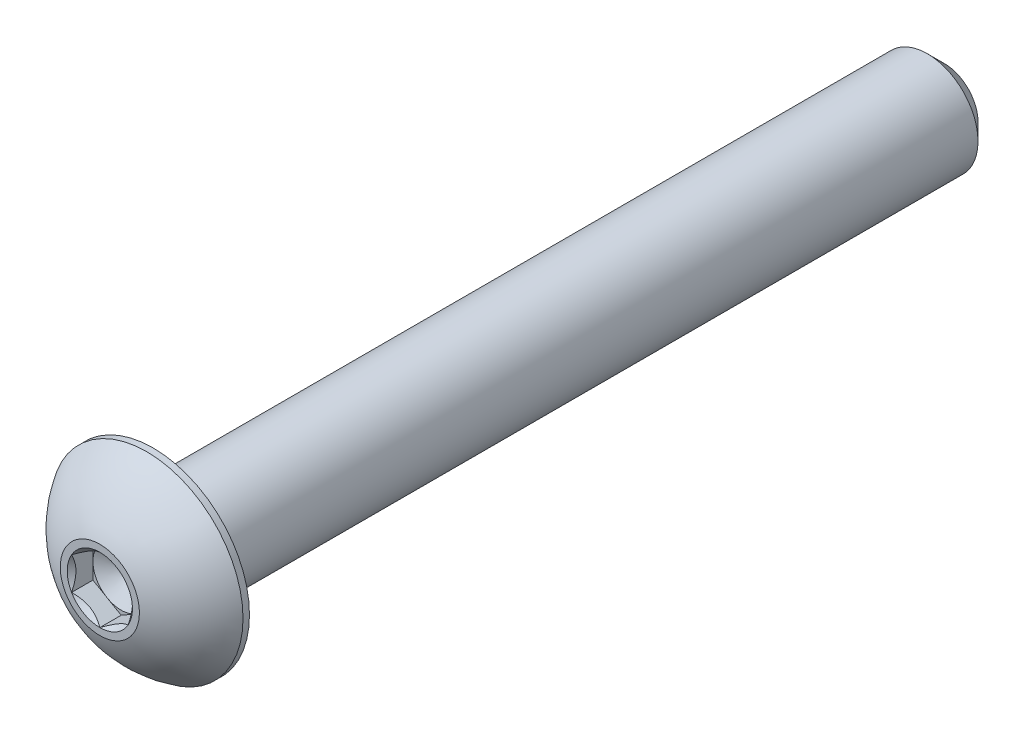
ISO-10303-21;
HEADER;
FILE_DESCRIPTION(('STEP AP214'),'2;1');
FILE_NAME('part.step','',(''),(''),'','','');
FILE_SCHEMA(('AUTOMOTIVE_DESIGN { 1 0 10303 214 1 1 1 1 }'));
ENDSEC;
DATA;
#1=APPLICATION_CONTEXT('core data for automotive mechanical design processes');
#2=APPLICATION_PROTOCOL_DEFINITION('international standard','automotive_design',2000,#1);
#3=PRODUCT_CONTEXT('',#1,'mechanical');
#4=PRODUCT('Part','Part','',(#3));
#5=PRODUCT_RELATED_PRODUCT_CATEGORY('part','',(#4));
#6=PRODUCT_DEFINITION_FORMATION('','',#4);
#7=PRODUCT_DEFINITION_CONTEXT('part definition',#1,'design');
#8=PRODUCT_DEFINITION('design','',#6,#7);
#9=PRODUCT_DEFINITION_SHAPE('','',#8);
#10=(LENGTH_UNIT() NAMED_UNIT(*) SI_UNIT(.MILLI.,.METRE.));
#11=(NAMED_UNIT(*) PLANE_ANGLE_UNIT() SI_UNIT($,.RADIAN.));
#12=(NAMED_UNIT(*) SI_UNIT($,.STERADIAN.) SOLID_ANGLE_UNIT());
#13=UNCERTAINTY_MEASURE_WITH_UNIT(LENGTH_MEASURE(1.E-05),#10,'distance_accuracy_value','');
#14=(GEOMETRIC_REPRESENTATION_CONTEXT(3) GLOBAL_UNCERTAINTY_ASSIGNED_CONTEXT((#13)) GLOBAL_UNIT_ASSIGNED_CONTEXT((#10,
#11,#12)) REPRESENTATION_CONTEXT('',''));
#15=CARTESIAN_POINT('',(0.,0.,0.));
#16=DIRECTION('',(0.,0.,1.));
#17=DIRECTION('',(1.,0.,0.));
#18=AXIS2_PLACEMENT_3D('',#15,#16,#17);
#19=CARTESIAN_POINT('',(0.,0.79375,11.8618));
#20=DIRECTION('',(0.,0.,-1.));
#21=DIRECTION('',(-1.,0.,0.));
#22=AXIS2_PLACEMENT_3D('',#19,#20,#21);
#23=PLANE('',#22);
#24=CARTESIAN_POINT('',(0.,0.,11.8618));
#25=DIRECTION('',(0.,0.,1.));
#26=DIRECTION('',(1.,0.,0.));
#27=AXIS2_PLACEMENT_3D('',#24,#25,#26);
#28=CIRCLE('',#27,1.11125);
#29=CARTESIAN_POINT('',(0.,1.11125,11.8618));
#30=VERTEX_POINT('',#29);
#31=EDGE_CURVE('E167',#30,#30,#28,.T.);
#32=ORIENTED_EDGE('',*,*,#31,.T.);
#33=EDGE_LOOP('',(#32));
#34=FACE_BOUND('',#33,.T.);
#35=CARTESIAN_POINT('',(0.,0.,11.8618));
#36=DIRECTION('',(0.,0.,1.));
#37=DIRECTION('',(1.,0.,0.));
#38=AXIS2_PLACEMENT_3D('',#35,#36,#37);
#39=CIRCLE('',#38,0.916543552338531);
#40=CARTESIAN_POINT('',(0.,0.916543552338531,11.8618));
#41=VERTEX_POINT('',#40);
#42=CARTESIAN_POINT('',(-0.79375,0.458271776169265,11.8618));
#43=VERTEX_POINT('',#42);
#44=EDGE_CURVE('E121',#41,#43,#39,.T.);
#45=ORIENTED_EDGE('',*,*,#44,.F.);
#46=CARTESIAN_POINT('',(0.,0.,11.8618));
#47=DIRECTION('',(0.,0.,1.));
#48=DIRECTION('',(1.,0.,0.));
#49=AXIS2_PLACEMENT_3D('',#46,#47,#48);
#50=CIRCLE('',#49,0.916543552338531);
#51=CARTESIAN_POINT('',(0.79375,0.458271776169266,11.8618));
#52=VERTEX_POINT('',#51);
#53=EDGE_CURVE('E106',#52,#41,#50,.T.);
#54=ORIENTED_EDGE('',*,*,#53,.F.);
#55=CARTESIAN_POINT('',(0.,0.,11.8618));
#56=DIRECTION('',(0.,0.,1.));
#57=DIRECTION('',(1.,0.,0.));
#58=AXIS2_PLACEMENT_3D('',#55,#56,#57);
#59=CIRCLE('',#58,0.916543552338531);
#60=CARTESIAN_POINT('',(0.79375,-0.458271776169265,11.8618));
#61=VERTEX_POINT('',#60);
#62=EDGE_CURVE('E117',#61,#52,#59,.T.);
#63=ORIENTED_EDGE('',*,*,#62,.F.);
#64=CARTESIAN_POINT('',(0.,0.,11.8618));
#65=DIRECTION('',(0.,0.,1.));
#66=DIRECTION('',(1.,0.,0.));
#67=AXIS2_PLACEMENT_3D('',#64,#65,#66);
#68=CIRCLE('',#67,0.916543552338531);
#69=CARTESIAN_POINT('',(0.,-0.916543552338531,11.8618));
#70=VERTEX_POINT('',#69);
#71=EDGE_CURVE('E138',#70,#61,#68,.T.);
#72=ORIENTED_EDGE('',*,*,#71,.F.);
#73=CARTESIAN_POINT('',(0.,0.,11.8618));
#74=DIRECTION('',(0.,0.,1.));
#75=DIRECTION('',(1.,0.,0.));
#76=AXIS2_PLACEMENT_3D('',#73,#74,#75);
#77=CIRCLE('',#76,0.916543552338531);
#78=CARTESIAN_POINT('',(-0.79375,-0.458271776169266,11.8618));
#79=VERTEX_POINT('',#78);
#80=EDGE_CURVE('E438',#79,#70,#77,.T.);
#81=ORIENTED_EDGE('',*,*,#80,.F.);
#82=CARTESIAN_POINT('',(0.,0.,11.8618));
#83=DIRECTION('',(0.,0.,1.));
#84=DIRECTION('',(1.,0.,0.));
#85=AXIS2_PLACEMENT_3D('',#82,#83,#84);
#86=CIRCLE('',#85,0.916543552338531);
#87=EDGE_CURVE('E447',#43,#79,#86,.T.);
#88=ORIENTED_EDGE('',*,*,#87,.F.);
#89=EDGE_LOOP('',(#45,#54,#63,#72,#81,#88));
#90=FACE_BOUND('',#89,.T.);
#91=ADVANCED_FACE('F33',(#34,#90),#23,.F.);
#92=CARTESIAN_POINT('',(0.,0.,-11.8618));
#93=DIRECTION('',(0.,0.,1.));
#94=DIRECTION('',(1.,0.,0.));
#95=AXIS2_PLACEMENT_3D('',#92,#93,#94);
#96=CONICAL_SURFACE('',#95,0.946150000000005,0.785398163397447);
#97=CARTESIAN_POINT('',(0.,0.,-11.38555));
#98=DIRECTION('',(0.,0.,1.));
#99=DIRECTION('',(1.,0.,0.));
#100=AXIS2_PLACEMENT_3D('',#97,#98,#99);
#101=CIRCLE('',#100,1.4224);
#102=CARTESIAN_POINT('',(1.4224,0.,-11.38555));
#103=VERTEX_POINT('',#102);
#104=EDGE_CURVE('E11',#103,#103,#101,.T.);
#105=ORIENTED_EDGE('',*,*,#104,.F.);
#106=EDGE_LOOP('',(#105));
#107=FACE_BOUND('',#106,.T.);
#108=CARTESIAN_POINT('',(0.,0.,-11.8618));
#109=DIRECTION('',(0.,0.,1.));
#110=DIRECTION('',(1.,0.,0.));
#111=AXIS2_PLACEMENT_3D('',#108,#109,#110);
#112=CIRCLE('',#111,0.946150000000005);
#113=CARTESIAN_POINT('',(0.946150000000005,0.,-11.8618));
#114=VERTEX_POINT('',#113);
#115=EDGE_CURVE('E160',#114,#114,#112,.T.);
#116=ORIENTED_EDGE('',*,*,#115,.T.);
#117=EDGE_LOOP('',(#116));
#118=FACE_BOUND('',#117,.T.);
#119=ADVANCED_FACE('F35',(#107,#118),#96,.T.);
#120=CARTESIAN_POINT('',(0.,0.,11.8618));
#121=DIRECTION('',(0.,0.,1.));
#122=DIRECTION('',(1.,0.,0.));
#123=AXIS2_PLACEMENT_3D('',#120,#121,#122);
#124=CYLINDRICAL_SURFACE('',#123,1.4224);
#125=CARTESIAN_POINT('',(0.,0.,10.3632));
#126=DIRECTION('',(0.,0.,1.));
#127=DIRECTION('',(1.,0.,0.));
#128=AXIS2_PLACEMENT_3D('',#125,#126,#127);
#129=CIRCLE('',#128,1.4224);
#130=CARTESIAN_POINT('',(1.4224,0.,10.3632));
#131=VERTEX_POINT('',#130);
#132=EDGE_CURVE('E41',#131,#131,#129,.T.);
#133=ORIENTED_EDGE('',*,*,#132,.F.);
#134=EDGE_LOOP('',(#133));
#135=FACE_BOUND('',#134,.T.);
#136=ORIENTED_EDGE('',*,*,#104,.T.);
#137=EDGE_LOOP('',(#136));
#138=FACE_BOUND('',#137,.T.);
#139=ADVANCED_FACE('F181',(#135,#138),#124,.T.);
#140=CARTESIAN_POINT('',(0.,2.7051,10.3632));
#141=DIRECTION('',(0.,0.,1.));
#142=DIRECTION('',(1.,0.,0.));
#143=AXIS2_PLACEMENT_3D('',#140,#141,#142);
#144=PLANE('',#143);
#145=CARTESIAN_POINT('',(0.,0.,10.3632));
#146=DIRECTION('',(0.,0.,1.));
#147=DIRECTION('',(1.,0.,0.));
#148=AXIS2_PLACEMENT_3D('',#145,#146,#147);
#149=CIRCLE('',#148,2.7051);
#150=CARTESIAN_POINT('',(2.7051,0.,10.3632));
#151=VERTEX_POINT('',#150);
#152=EDGE_CURVE('E174',#151,#151,#149,.T.);
#153=ORIENTED_EDGE('',*,*,#152,.F.);
#154=EDGE_LOOP('',(#153));
#155=FACE_BOUND('',#154,.T.);
#156=ORIENTED_EDGE('',*,*,#132,.T.);
#157=EDGE_LOOP('',(#156));
#158=FACE_BOUND('',#157,.T.);
#159=ADVANCED_FACE('F179',(#155,#158),#144,.F.);
#160=CARTESIAN_POINT('',(0.,0.,11.8618));
#161=DIRECTION('',(0.,0.,1.));
#162=DIRECTION('',(1.,0.,0.));
#163=AXIS2_PLACEMENT_3D('',#160,#161,#162);
#164=CYLINDRICAL_SURFACE('',#163,2.7051);
#165=CARTESIAN_POINT('',(0.,0.,10.5446285714286));
#166=DIRECTION('',(0.,0.,1.));
#167=DIRECTION('',(1.,0.,0.));
#168=AXIS2_PLACEMENT_3D('',#165,#166,#167);
#169=CIRCLE('',#168,2.7051);
#170=CARTESIAN_POINT('',(0.,2.7051,10.5446285714286));
#171=VERTEX_POINT('',#170);
#172=EDGE_CURVE('E171',#171,#171,#169,.T.);
#173=ORIENTED_EDGE('',*,*,#172,.F.);
#174=EDGE_LOOP('',(#173));
#175=FACE_BOUND('',#174,.T.);
#176=ORIENTED_EDGE('',*,*,#152,.T.);
#177=EDGE_LOOP('',(#176));
#178=FACE_BOUND('',#177,.T.);
#179=ADVANCED_FACE('F200',(#175,#178),#164,.T.);
#180=CARTESIAN_POINT('',(0.,0.,8.89421740210547));
#181=DIRECTION('',(0.,0.,1.));
#182=DIRECTION('',(0.,1.,0.));
#183=AXIS2_PLACEMENT_3D('',#180,#181,#182);
#184=SPHERICAL_SURFACE('',#183,3.16882044897253);
#185=CARTESIAN_POINT('',(0.,1.11125,11.8618));
#186=CARTESIAN_POINT('',(0.,1.13179667759226,11.8541060663439));
#187=CARTESIAN_POINT('',(0.,1.15226342355972,11.8461986796626));
#188=CARTESIAN_POINT('',(0.,1.19302827978612,11.8299605557292));
#189=CARTESIAN_POINT('',(0.,1.21332639004505,11.8216298184771));
#190=CARTESIAN_POINT('',(0.,1.25374520239545,11.8045485488821));
#191=CARTESIAN_POINT('',(0.,1.27386590448691,11.7957980165391));
#192=CARTESIAN_POINT('',(0.,1.31392122407572,11.7778809422907));
#193=CARTESIAN_POINT('',(0.,1.33385584157307,11.7687144003852));
#194=CARTESIAN_POINT('',(0.,1.37353039060483,11.7499692589034));
#195=CARTESIAN_POINT('',(0.,1.39327032213924,11.7403906593271));
#196=CARTESIAN_POINT('',(0.,1.43254698326807,11.7208255356803));
#197=CARTESIAN_POINT('',(0.,1.45208371286248,11.7108390116098));
#198=CARTESIAN_POINT('',(0.,1.49094554142534,11.690462347198));
#199=CARTESIAN_POINT('',(0.,1.51027064039377,11.6800722068568));
#200=CARTESIAN_POINT('',(0.,1.54870087042163,11.658892792509));
#201=CARTESIAN_POINT('',(0.,1.56780600148105,11.6481035185024));
#202=CARTESIAN_POINT('',(0.,1.60578805328026,11.6261304915572));
#203=CARTESIAN_POINT('',(0.,1.62466497402005,11.6149467386186));
#204=CARTESIAN_POINT('',(0.,1.66218246123194,11.5921895787487));
#205=CARTESIAN_POINT('',(0.,1.68082302770403,11.5806161718172));
#206=CARTESIAN_POINT('',(0.,1.71785976439933,11.5570846970017));
#207=CARTESIAN_POINT('',(0.,1.73625593462253,11.5451266291175));
#208=CARTESIAN_POINT('',(0.,1.77279594227768,11.5208309913898));
#209=CARTESIAN_POINT('',(0.,1.79093977970964,11.5084934215462));
#210=CARTESIAN_POINT('',(0.,1.82696729410213,11.4834441026187));
#211=CARTESIAN_POINT('',(0.,1.84485097106267,11.4707323535347));
#212=CARTESIAN_POINT('',(0.,1.88035044907158,11.4449401602753));
#213=CARTESIAN_POINT('',(0.,1.89796625011995,11.4318597160999));
#214=CARTESIAN_POINT('',(0.,1.93292237643174,11.4053357758702));
#215=CARTESIAN_POINT('',(0.,1.95026270169517,11.391892279816));
#216=CARTESIAN_POINT('',(0.,1.98466039541108,11.3646480356704));
#217=CARTESIAN_POINT('',(0.,2.00171776386356,11.3508472875792));
#218=CARTESIAN_POINT('',(0.,2.03554218500583,11.3228944933284));
#219=CARTESIAN_POINT('',(0.,2.05230923769562,11.3087424471689));
#220=CARTESIAN_POINT('',(0.,2.08554579360983,11.2800931623088));
#221=CARTESIAN_POINT('',(0.,2.10201529683424,11.2655959236082));
#222=CARTESIAN_POINT('',(0.,2.13464964848491,11.236262508117));
#223=CARTESIAN_POINT('',(0.,2.15081449691115,11.2214263313265));
#224=CARTESIAN_POINT('',(0.,2.18283256506795,11.1914214403329));
#225=CARTESIAN_POINT('',(0.,2.19868578479851,11.1762527261297));
#226=CARTESIAN_POINT('',(0.,2.23007375611036,11.1455893044524));
#227=CARTESIAN_POINT('',(0.,2.24560850769166,11.1300945969782));
#228=CARTESIAN_POINT('',(0.,2.27635284064621,11.0987858735419));
#229=CARTESIAN_POINT('',(0.,2.29156242201947,11.0829718575797));
#230=CARTESIAN_POINT('',(0.,2.32164985278493,11.0510313397071));
#231=CARTESIAN_POINT('',(0.,2.33652770217713,11.0349048377968));
#232=CARTESIAN_POINT('',(0.,2.3659452503257,11.0023463053826));
#233=CARTESIAN_POINT('',(0.,2.38048494908206,10.9859142748787));
#234=CARTESIAN_POINT('',(0.,2.40921992318589,10.9527517744412));
#235=CARTESIAN_POINT('',(0.,2.42341519853336,10.9360213045077));
#236=CARTESIAN_POINT('',(0.,2.45145520165522,10.9022691431393));
#237=CARTESIAN_POINT('',(0.,2.4652999294296,10.8852474517045));
#238=CARTESIAN_POINT('',(0.,2.49263286441426,10.8509201908624));
#239=CARTESIAN_POINT('',(0.,2.50612107162454,10.8336146214551));
#240=CARTESIAN_POINT('',(0.,2.53273514653018,10.7987270708151));
#241=CARTESIAN_POINT('',(0.,2.54586101422555,10.7811450895823));
#242=CARTESIAN_POINT('',(0.,2.57174474661843,10.7457123001428));
#243=CARTESIAN_POINT('',(0.,2.58450261131594,10.7278614919362));
#244=CARTESIAN_POINT('',(0.,2.60964483618243,10.6918987514157));
#245=CARTESIAN_POINT('',(0.,2.62202919635141,10.6737868191017));
#246=CARTESIAN_POINT('',(0.,2.64641905987448,10.637309638288));
#247=CARTESIAN_POINT('',(0.,2.65842456322856,10.6189443897881));
#248=CARTESIAN_POINT('',(0.,2.68205156867364,10.5819685221751));
#249=CARTESIAN_POINT('',(0.,2.69367307076464,10.563357903062));
#250=CARTESIAN_POINT('',(0.,2.7051,10.5446285714286));
#251=B_SPLINE_CURVE_WITH_KNOTS('',3,(#185,#186,#187,#188,#189,#190,#191,#192,#193,#194,#195,
#196,#197,#198,#199,#200,#201,#202,#203,#204,#205,#206,#207,#208,#209,#210,#211,#212,#213,#214,
#215,#216,#217,#218,#219,#220,#221,#222,#223,#224,#225,#226,#227,#228,#229,#230,#231,#232,#233,
#234,#235,#236,#237,#238,#239,#240,#241,#242,#243,#244,#245,#246,#247,#248,#249,#250),
.UNSPECIFIED.,.F.,.F.,(4,2,2,2,2,2,2,2,2,2,2,2,2,2,2,2,2,2,2,2,2,2,2,2,2,2,2,2,2,2,2,2,4),(0.,
0.0658187445891968,0.131637489178393,0.197456233767589,0.263274978356786,0.329093722945982,
0.394912467535179,0.460731212124375,0.526549956713571,0.592368701302767,0.658187445891964,
0.72400619048116,0.789824935070356,0.855643679659553,0.921462424248748,0.987281168837945,
1.05309991342714,1.11891865801634,1.18473740260553,1.25055614719473,1.31637489178393,
1.38219363637312,1.44801238096232,1.51383112555152,1.57964987014071,1.64546861472991,
1.71128735931911,1.7771061039083,1.8429248484975,1.9087435930867,1.97456233767589,
2.04038108226509,2.10619982685428),.UNSPECIFIED.);
#252=EDGE_CURVE('BSEAM192',#30,#171,#251,.T.);
#253=ORIENTED_EDGE('',*,*,#31,.F.);
#254=ORIENTED_EDGE('',*,*,#172,.T.);
#255=ORIENTED_EDGE('',*,*,#252,.T.);
#256=ORIENTED_EDGE('',*,*,#252,.F.);
#257=EDGE_LOOP('',(#253,#255,#254,#256));
#258=FACE_BOUND('',#257,.T.);
#259=ADVANCED_FACE('F192',(#258),#184,.T.);
#260=CARTESIAN_POINT('',(0.,0.946150000000005,-11.8618));
#261=DIRECTION('',(0.,0.,1.));
#262=DIRECTION('',(1.,0.,0.));
#263=AXIS2_PLACEMENT_3D('',#260,#261,#262);
#264=PLANE('',#263);
#265=ORIENTED_EDGE('',*,*,#115,.F.);
#266=EDGE_LOOP('',(#265));
#267=FACE_BOUND('',#266,.T.);
#268=ADVANCED_FACE('F190',(#267),#264,.F.);
#269=CARTESIAN_POINT('',(0.79375,0.458271776169266,11.8618));
#270=DIRECTION('',(-0.5,-0.866025403784439,0.));
#271=DIRECTION('',(0.866025403784439,-0.5,0.));
#272=AXIS2_PLACEMENT_3D('',#269,#270,#271);
#273=PLANE('',#272);
#274=CARTESIAN_POINT('',(0.79395,0.458156306115428,11.8619154918722));
#275=CARTESIAN_POINT('',(0.7666563268291,0.473914315667821,11.84616677882));
#276=CARTESIAN_POINT('',(0.738906237701709,0.489935837095556,11.8313425475842));
#277=CARTESIAN_POINT('',(0.68232025046316,0.522605772060093,11.8041990377859));
#278=CARTESIAN_POINT('',(0.653478963353311,0.539257296936739,11.7918948737284));
#279=CARTESIAN_POINT('',(0.595321679020445,0.572834420701657,11.7708173665706));
#280=CARTESIAN_POINT('',(0.56602051479722,0.589751455753505,11.7619910081475));
#281=CARTESIAN_POINT('',(0.506773157113024,0.62395793366125,11.7483912387242));
#282=CARTESIAN_POINT('',(0.476828775638363,0.641246330366362,11.74360766813));
#283=CARTESIAN_POINT('',(0.425225377533548,0.671039566153276,11.7392934094559));
#284=CARTESIAN_POINT('',(0.403633531741489,0.683505624133623,11.738655271411));
#285=CARTESIAN_POINT('',(0.360491632722969,0.708413611145317,11.7397261397912));
#286=CARTESIAN_POINT('',(0.338941589763516,0.720855534249005,11.7414356638818));
#287=CARTESIAN_POINT('',(0.274599154455218,0.758003656594567,11.7499727911586));
#288=CARTESIAN_POINT('',(0.232126946019305,0.782524997568119,11.7602099191368));
#289=CARTESIAN_POINT('',(0.157575609219719,0.825567231937807,11.7849185898405));
#290=CARTESIAN_POINT('',(0.125147212182333,0.844289775696729,11.7980961746753));
#291=CARTESIAN_POINT('',(0.0615608535385163,0.881001376976525,11.8277810399517));
#292=CARTESIAN_POINT('',(0.0303991453684826,0.898992597576903,11.8442774878932));
#293=CARTESIAN_POINT('',(-0.000200000000000791,0.916659022392369,11.8619154918722));
#294=B_SPLINE_CURVE_WITH_KNOTS('',3,(#274,#275,#276,#277,#278,#279,#280,#281,#282,#283,#284,
#285,#286,#287,#288,#289,#290,#291,#292,#293),.UNSPECIFIED.,.F.,.F.,(4,2,2,2,2,2,2,2,2,4),(0.,
0.105768699105622,0.21215429718622,0.316848842533858,0.421279499712345,0.495991864977072,
0.570720707151282,0.720221070373882,0.8391503699648,0.957697614118391),.UNSPECIFIED.);
#295=EDGE_CURVE('E103',#52,#41,#294,.T.);
#296=ORIENTED_EDGE('',*,*,#295,.T.);
#297=DIRECTION('',(0.,0.,-1.));
#298=VECTOR('',#297,1.);
#299=CARTESIAN_POINT('',(0.,0.916543552338531,11.8618));
#300=LINE('',#299,#298);
#301=CARTESIAN_POINT('',(0.,0.916543552338531,11.26236));
#302=VERTEX_POINT('',#301);
#303=EDGE_CURVE('E158',#41,#302,#300,.T.);
#304=ORIENTED_EDGE('',*,*,#303,.T.);
#305=DIRECTION('',(-0.866025403784439,0.499999999999999,0.));
#306=VECTOR('',#305,1.);
#307=CARTESIAN_POINT('',(0.79375,0.458271776169266,11.26236));
#308=LINE('',#307,#306);
#309=CARTESIAN_POINT('',(0.396875,0.687407664253898,11.26236));
#310=VERTEX_POINT('',#309);
#311=EDGE_CURVE('E474',#310,#302,#308,.T.);
#312=ORIENTED_EDGE('',*,*,#311,.F.);
#313=CARTESIAN_POINT('',(0.79375,0.458271776169266,11.26236));
#314=VERTEX_POINT('',#313);
#315=EDGE_CURVE('E48',#314,#310,#308,.T.);
#316=ORIENTED_EDGE('',*,*,#315,.F.);
#317=DIRECTION('',(0.,0.,-1.));
#318=VECTOR('',#317,1.);
#319=CARTESIAN_POINT('',(0.79375,0.458271776169266,11.8618));
#320=LINE('',#319,#318);
#321=EDGE_CURVE('E134',#52,#314,#320,.T.);
#322=ORIENTED_EDGE('',*,*,#321,.F.);
#323=EDGE_LOOP('',(#296,#304,#312,#316,#322));
#324=FACE_BOUND('',#323,.T.);
#325=ADVANCED_FACE('F140',(#324),#273,.T.);
#326=CARTESIAN_POINT('',(0.,0.916543552338531,11.8618));
#327=DIRECTION('',(0.5,-0.866025403784438,0.));
#328=DIRECTION('',(0.866025403784438,0.5,0.));
#329=AXIS2_PLACEMENT_3D('',#326,#327,#328);
#330=PLANE('',#329);
#331=CARTESIAN_POINT('',(0.000199999999999363,0.916659022392369,11.8619154918722));
#332=CARTESIAN_POINT('',(-0.0270936731709004,0.900901012839976,11.84616677882));
#333=CARTESIAN_POINT('',(-0.0548437622982918,0.88487949141224,11.8313425475842));
#334=CARTESIAN_POINT('',(-0.111429749536841,0.852209556447703,11.8041990377859));
#335=CARTESIAN_POINT('',(-0.140271036646689,0.835558031571057,11.7918948737284));
#336=CARTESIAN_POINT('',(-0.198428320979556,0.801980907806139,11.7708173665706));
#337=CARTESIAN_POINT('',(-0.22772948520278,0.785063872754291,11.7619910081475));
#338=CARTESIAN_POINT('',(-0.286976842886976,0.750857394846546,11.7483912387242));
#339=CARTESIAN_POINT('',(-0.316921224361637,0.733568998141434,11.74360766813));
#340=CARTESIAN_POINT('',(-0.368524622466452,0.70377576235452,11.7392934094559));
#341=CARTESIAN_POINT('',(-0.390116468258511,0.691309704374173,11.738655271411));
#342=CARTESIAN_POINT('',(-0.433258367277031,0.666401717362479,11.7397261397912));
#343=CARTESIAN_POINT('',(-0.454808410236484,0.653959794258791,11.7414356638818));
#344=CARTESIAN_POINT('',(-0.519150845544782,0.616811671913229,11.7499727911586));
#345=CARTESIAN_POINT('',(-0.561623053980695,0.592290330939677,11.7602099191368));
#346=CARTESIAN_POINT('',(-0.636174390780281,0.549248096569989,11.7849185898405));
#347=CARTESIAN_POINT('',(-0.668602787817667,0.530525552811067,11.7980961746753));
#348=CARTESIAN_POINT('',(-0.732189146461483,0.493813951531271,11.8277810399517));
#349=CARTESIAN_POINT('',(-0.763350854631517,0.475822730930893,11.8442774878932));
#350=CARTESIAN_POINT('',(-0.79395,0.458156306115427,11.8619154918722));
#351=B_SPLINE_CURVE_WITH_KNOTS('',3,(#331,#332,#333,#334,#335,#336,#337,#338,#339,#340,#341,
#342,#343,#344,#345,#346,#347,#348,#349,#350),.UNSPECIFIED.,.F.,.F.,(4,2,2,2,2,2,2,2,2,4),(0.,
0.105768699105622,0.21215429718622,0.316848842533858,0.421279499712345,0.495991864977073,
0.570720707151282,0.720221070373882,0.8391503699648,0.957697614118391),.UNSPECIFIED.);
#352=EDGE_CURVE('E462',#41,#43,#351,.T.);
#353=ORIENTED_EDGE('',*,*,#352,.T.);
#354=DIRECTION('',(0.,0.,-1.));
#355=VECTOR('',#354,1.);
#356=CARTESIAN_POINT('',(-0.79375,0.458271776169265,11.8618));
#357=LINE('',#356,#355);
#358=CARTESIAN_POINT('',(-0.79375,0.458271776169265,11.26236));
#359=VERTEX_POINT('',#358);
#360=EDGE_CURVE('E155',#43,#359,#357,.T.);
#361=ORIENTED_EDGE('',*,*,#360,.T.);
#362=DIRECTION('',(-0.866025403784438,-0.5,0.));
#363=VECTOR('',#362,1.);
#364=CARTESIAN_POINT('',(0.,0.916543552338531,11.26236));
#365=LINE('',#364,#363);
#366=CARTESIAN_POINT('',(-0.396875,0.687407664253898,11.26236));
#367=VERTEX_POINT('',#366);
#368=EDGE_CURVE('E476',#367,#359,#365,.T.);
#369=ORIENTED_EDGE('',*,*,#368,.F.);
#370=EDGE_CURVE('E477',#302,#367,#365,.T.);
#371=ORIENTED_EDGE('',*,*,#370,.F.);
#372=ORIENTED_EDGE('',*,*,#303,.F.);
#373=EDGE_LOOP('',(#353,#361,#369,#371,#372));
#374=FACE_BOUND('',#373,.T.);
#375=ADVANCED_FACE('F198',(#374),#330,.T.);
#376=CARTESIAN_POINT('',(-0.79375,0.458271776169265,11.8618));
#377=DIRECTION('',(1.,0.,0.));
#378=DIRECTION('',(0.,1.,0.));
#379=AXIS2_PLACEMENT_3D('',#376,#377,#378);
#380=PLANE('',#379);
#381=CARTESIAN_POINT('',(-0.79375,-0.886414096599243,12.1351173694292));
#382=CARTESIAN_POINT('',(-0.79375,-0.864701714199918,12.1189447067883));
#383=CARTESIAN_POINT('',(-0.79375,-0.842865388063717,12.1029388524031));
#384=CARTESIAN_POINT('',(-0.79375,-0.798895674093468,12.0713287658015));
#385=CARTESIAN_POINT('',(-0.79375,-0.77676221065422,12.055724638867));
#386=CARTESIAN_POINT('',(-0.79375,-0.709518845973244,12.009394832716));
#387=CARTESIAN_POINT('',(-0.79375,-0.663896155634679,11.9794009491476));
#388=CARTESIAN_POINT('',(-0.79375,-0.568400086548213,11.9207651238942));
#389=CARTESIAN_POINT('',(-0.79375,-0.518429613643663,11.8922793822523));
#390=CARTESIAN_POINT('',(-0.79375,-0.416032101977318,11.8403450488017));
#391=CARTESIAN_POINT('',(-0.79375,-0.363614070820858,11.8168795256206));
#392=CARTESIAN_POINT('',(-0.79375,-0.284656617559876,11.788183672504));
#393=CARTESIAN_POINT('',(-0.79375,-0.259232429165401,11.779904160019));
#394=CARTESIAN_POINT('',(-0.79375,-0.20780736405375,11.7653843748874));
#395=CARTESIAN_POINT('',(-0.79375,-0.181806445486241,11.759144250749));
#396=CARTESIAN_POINT('',(-0.79375,-0.104000822329059,11.7442094134753));
#397=CARTESIAN_POINT('',(-0.79375,-0.0514629352178524,11.7389391752515));
#398=CARTESIAN_POINT('',(-0.79375,0.0519230063012082,11.739072987509));
#399=CARTESIAN_POINT('',(-0.79375,0.102771763174831,11.7441435158735));
#400=CARTESIAN_POINT('',(-0.79375,0.178135386060791,11.7583587338884));
#401=CARTESIAN_POINT('',(-0.79375,0.203324278837549,11.7642816595805));
#402=CARTESIAN_POINT('',(-0.79375,0.253165828732922,11.7780603634404));
#403=CARTESIAN_POINT('',(-0.79375,0.277818539396018,11.7859159476346));
#404=CARTESIAN_POINT('',(-0.79375,0.356745861124011,11.8139886371802));
#405=CARTESIAN_POINT('',(-0.79375,0.409857837794496,11.8374580422539));
#406=CARTESIAN_POINT('',(-0.79375,0.513576140604893,11.8895968506742));
#407=CARTESIAN_POINT('',(-0.79375,0.564172447910596,11.9182852088216));
#408=CARTESIAN_POINT('',(-0.79375,0.660846745738732,11.9774268692853));
#409=CARTESIAN_POINT('',(-0.79375,0.707024109054008,12.0077197596903));
#410=CARTESIAN_POINT('',(-0.79375,0.775058121051355,12.0545303495439));
#411=CARTESIAN_POINT('',(-0.79375,0.797441820874695,12.070295263199));
#412=CARTESIAN_POINT('',(-0.79375,0.841904444862719,12.1022370071412));
#413=CARTESIAN_POINT('',(-0.79375,0.863983450465097,12.1184137239408));
#414=CARTESIAN_POINT('',(-0.79375,0.885935743338026,12.1347610520342));
#415=B_SPLINE_CURVE_WITH_KNOTS('',3,(#381,#382,#383,#384,#385,#386,#387,#388,#389,#390,#391,
#392,#393,#394,#395,#396,#397,#398,#399,#400,#401,#402,#403,#404,#405,#406,#407,#408,#409,#410,
#411,#412,#413,#414),.UNSPECIFIED.,.F.,.F.,(4,2,2,2,2,2,2,2,2,2,2,2,2,2,2,2,4),(0.,
0.0812188387950319,0.162458750511488,0.326178806253454,0.498586653888073,0.670403531438167,
0.750543907216534,0.83069011751737,0.988028410529604,1.14037233605713,1.21793318643015,
1.29548625548648,1.46917505876894,1.64350775825017,1.80910713566104,1.8912384673972,
1.97334740474277),.UNSPECIFIED.);
#416=EDGE_CURVE('E455',#43,#79,#415,.F.);
#417=ORIENTED_EDGE('',*,*,#416,.T.);
#418=DIRECTION('',(0.,0.,-1.));
#419=VECTOR('',#418,1.);
#420=CARTESIAN_POINT('',(-0.79375,-0.458271776169266,11.8618));
#421=LINE('',#420,#419);
#422=CARTESIAN_POINT('',(-0.79375,-0.458271776169266,11.26236));
#423=VERTEX_POINT('',#422);
#424=EDGE_CURVE('E152',#79,#423,#421,.T.);
#425=ORIENTED_EDGE('',*,*,#424,.T.);
#426=DIRECTION('',(0.,-1.,0.));
#427=VECTOR('',#426,1.);
#428=CARTESIAN_POINT('',(-0.79375,0.458271776169265,11.26236));
#429=LINE('',#428,#427);
#430=CARTESIAN_POINT('',(-0.79375,0.,11.26236));
#431=VERTEX_POINT('',#430);
#432=EDGE_CURVE('E480',#431,#423,#429,.T.);
#433=ORIENTED_EDGE('',*,*,#432,.F.);
#434=EDGE_CURVE('E481',#359,#431,#429,.T.);
#435=ORIENTED_EDGE('',*,*,#434,.F.);
#436=ORIENTED_EDGE('',*,*,#360,.F.);
#437=EDGE_LOOP('',(#417,#425,#433,#435,#436));
#438=FACE_BOUND('',#437,.T.);
#439=ADVANCED_FACE('F319',(#438),#380,.T.);
#440=CARTESIAN_POINT('',(-0.79375,-0.458271776169266,11.8618));
#441=DIRECTION('',(0.5,0.866025403784439,0.));
#442=DIRECTION('',(-0.866025403784439,0.5,0.));
#443=AXIS2_PLACEMENT_3D('',#440,#441,#442);
#444=PLANE('',#443);
#445=CARTESIAN_POINT('',(-0.79395,-0.458156306115428,11.8619154918722));
#446=CARTESIAN_POINT('',(-0.7666563268291,-0.473914315667821,11.84616677882));
#447=CARTESIAN_POINT('',(-0.738906237701708,-0.489935837095556,11.8313425475842));
#448=CARTESIAN_POINT('',(-0.68232025046316,-0.522605772060093,11.8041990377859));
#449=CARTESIAN_POINT('',(-0.653478963353311,-0.539257296936739,11.7918948737284));
#450=CARTESIAN_POINT('',(-0.595321679020445,-0.572834420701658,11.7708173665706));
#451=CARTESIAN_POINT('',(-0.56602051479722,-0.589751455753506,11.7619910081475));
#452=CARTESIAN_POINT('',(-0.506773157113023,-0.623957933661251,11.7483912387242));
#453=CARTESIAN_POINT('',(-0.476828775638363,-0.641246330366363,11.74360766813));
#454=CARTESIAN_POINT('',(-0.425225377533548,-0.671039566153277,11.7392934094559));
#455=CARTESIAN_POINT('',(-0.403633531741489,-0.683505624133623,11.738655271411));
#456=CARTESIAN_POINT('',(-0.360491632722969,-0.708413611145317,11.7397261397912));
#457=CARTESIAN_POINT('',(-0.338941589763516,-0.720855534249006,11.7414356638818));
#458=CARTESIAN_POINT('',(-0.274599154455218,-0.758003656594567,11.7499727911586));
#459=CARTESIAN_POINT('',(-0.232126946019305,-0.782524997568119,11.7602099191368));
#460=CARTESIAN_POINT('',(-0.157575609219719,-0.825567231937807,11.7849185898405));
#461=CARTESIAN_POINT('',(-0.125147212182333,-0.844289775696729,11.7980961746753));
#462=CARTESIAN_POINT('',(-0.0615608535385164,-0.881001376976525,11.8277810399517));
#463=CARTESIAN_POINT('',(-0.0303991453684826,-0.898992597576903,11.8442774878932));
#464=CARTESIAN_POINT('',(0.000200000000000575,-0.916659022392369,11.8619154918722));
#465=B_SPLINE_CURVE_WITH_KNOTS('',3,(#445,#446,#447,#448,#449,#450,#451,#452,#453,#454,#455,
#456,#457,#458,#459,#460,#461,#462,#463,#464),.UNSPECIFIED.,.F.,.F.,(4,2,2,2,2,2,2,2,2,4),(0.,
0.105768699105622,0.21215429718622,0.316848842533859,0.421279499712345,0.495991864977072,
0.570720707151282,0.720221070373883,0.8391503699648,0.957697614118391),.UNSPECIFIED.);
#466=EDGE_CURVE('E440',#79,#70,#465,.T.);
#467=ORIENTED_EDGE('',*,*,#466,.T.);
#468=DIRECTION('',(0.,0.,-1.));
#469=VECTOR('',#468,1.);
#470=CARTESIAN_POINT('',(0.,-0.916543552338531,11.8618));
#471=LINE('',#470,#469);
#472=CARTESIAN_POINT('',(0.,-0.916543552338531,11.26236));
#473=VERTEX_POINT('',#472);
#474=EDGE_CURVE('E143',#70,#473,#471,.T.);
#475=ORIENTED_EDGE('',*,*,#474,.T.);
#476=DIRECTION('',(0.866025403784439,-0.499999999999999,0.));
#477=VECTOR('',#476,1.);
#478=CARTESIAN_POINT('',(-0.79375,-0.458271776169266,11.26236));
#479=LINE('',#478,#477);
#480=CARTESIAN_POINT('',(-0.396875,-0.687407664253899,11.26236));
#481=VERTEX_POINT('',#480);
#482=EDGE_CURVE('E484',#481,#473,#479,.T.);
#483=ORIENTED_EDGE('',*,*,#482,.F.);
#484=EDGE_CURVE('E485',#423,#481,#479,.T.);
#485=ORIENTED_EDGE('',*,*,#484,.F.);
#486=ORIENTED_EDGE('',*,*,#424,.F.);
#487=EDGE_LOOP('',(#467,#475,#483,#485,#486));
#488=FACE_BOUND('',#487,.T.);
#489=ADVANCED_FACE('F329',(#488),#444,.T.);
#490=CARTESIAN_POINT('',(0.,-0.916543552338531,11.8618));
#491=DIRECTION('',(-0.5,0.866025403784438,0.));
#492=DIRECTION('',(-0.866025403784439,-0.5,0.));
#493=AXIS2_PLACEMENT_3D('',#490,#491,#492);
#494=PLANE('',#493);
#495=CARTESIAN_POINT('',(-0.000199999999999494,-0.916659022392369,11.8619154918722));
#496=CARTESIAN_POINT('',(0.0270936731709004,-0.900901012839976,11.84616677882));
#497=CARTESIAN_POINT('',(0.0548437622982918,-0.884879491412241,11.8313425475842));
#498=CARTESIAN_POINT('',(0.111429749536841,-0.852209556447704,11.8041990377859));
#499=CARTESIAN_POINT('',(0.140271036646689,-0.835558031571057,11.7918948737284));
#500=CARTESIAN_POINT('',(0.198428320979555,-0.801980907806139,11.7708173665706));
#501=CARTESIAN_POINT('',(0.22772948520278,-0.785063872754291,11.7619910081475));
#502=CARTESIAN_POINT('',(0.286976842886976,-0.750857394846546,11.7483912387242));
#503=CARTESIAN_POINT('',(0.316921224361637,-0.733568998141434,11.74360766813));
#504=CARTESIAN_POINT('',(0.368524622466452,-0.70377576235452,11.7392934094559));
#505=CARTESIAN_POINT('',(0.390116468258511,-0.691309704374174,11.738655271411));
#506=CARTESIAN_POINT('',(0.433258367277031,-0.66640171736248,11.7397261397912));
#507=CARTESIAN_POINT('',(0.454808410236484,-0.653959794258791,11.7414356638818));
#508=CARTESIAN_POINT('',(0.519150845544782,-0.616811671913229,11.7499727911586));
#509=CARTESIAN_POINT('',(0.561623053980694,-0.592290330939677,11.7602099191368));
#510=CARTESIAN_POINT('',(0.636174390780281,-0.54924809656999,11.7849185898405));
#511=CARTESIAN_POINT('',(0.668602787817666,-0.530525552811067,11.7980961746753));
#512=CARTESIAN_POINT('',(0.732189146461483,-0.493813951531271,11.8277810399517));
#513=CARTESIAN_POINT('',(0.763350854631517,-0.475822730930894,11.8442774878932));
#514=CARTESIAN_POINT('',(0.79395,-0.458156306115427,11.8619154918722));
#515=B_SPLINE_CURVE_WITH_KNOTS('',3,(#495,#496,#497,#498,#499,#500,#501,#502,#503,#504,#505,
#506,#507,#508,#509,#510,#511,#512,#513,#514),.UNSPECIFIED.,.F.,.F.,(4,2,2,2,2,2,2,2,2,4),(0.,
0.105768699105622,0.21215429718622,0.316848842533859,0.421279499712345,0.495991864977072,
0.570720707151281,0.720221070373882,0.8391503699648,0.957697614118391),.UNSPECIFIED.);
#516=EDGE_CURVE('E431',#70,#61,#515,.T.);
#517=ORIENTED_EDGE('',*,*,#516,.T.);
#518=DIRECTION('',(0.,0.,-1.));
#519=VECTOR('',#518,1.);
#520=CARTESIAN_POINT('',(0.79375,-0.458271776169265,11.8618));
#521=LINE('',#520,#519);
#522=CARTESIAN_POINT('',(0.79375,-0.458271776169265,11.26236));
#523=VERTEX_POINT('',#522);
#524=EDGE_CURVE('E137',#61,#523,#521,.T.);
#525=ORIENTED_EDGE('',*,*,#524,.T.);
#526=DIRECTION('',(0.866025403784438,0.5,0.));
#527=VECTOR('',#526,1.);
#528=CARTESIAN_POINT('',(0.,-0.916543552338531,11.26236));
#529=LINE('',#528,#527);
#530=CARTESIAN_POINT('',(0.396875,-0.687407664253898,11.26236));
#531=VERTEX_POINT('',#530);
#532=EDGE_CURVE('E487',#531,#523,#529,.T.);
#533=ORIENTED_EDGE('',*,*,#532,.F.);
#534=EDGE_CURVE('E488',#473,#531,#529,.T.);
#535=ORIENTED_EDGE('',*,*,#534,.F.);
#536=ORIENTED_EDGE('',*,*,#474,.F.);
#537=EDGE_LOOP('',(#517,#525,#533,#535,#536));
#538=FACE_BOUND('',#537,.T.);
#539=ADVANCED_FACE('F339',(#538),#494,.T.);
#540=CARTESIAN_POINT('',(0.79375,-0.458271776169265,11.8618));
#541=DIRECTION('',(-1.,0.,0.));
#542=DIRECTION('',(0.,-1.,0.));
#543=AXIS2_PLACEMENT_3D('',#540,#541,#542);
#544=PLANE('',#543);
#545=CARTESIAN_POINT('',(0.79375,-0.886414096599242,12.1351173694292));
#546=CARTESIAN_POINT('',(0.79375,-0.864701714199918,12.1189447067883));
#547=CARTESIAN_POINT('',(0.79375,-0.842865388063717,12.1029388524031));
#548=CARTESIAN_POINT('',(0.79375,-0.798895674093467,12.0713287658015));
#549=CARTESIAN_POINT('',(0.79375,-0.776762210654218,12.055724638867));
#550=CARTESIAN_POINT('',(0.79375,-0.709518845973243,12.009394832716));
#551=CARTESIAN_POINT('',(0.79375,-0.663896155634678,11.9794009491476));
#552=CARTESIAN_POINT('',(0.79375,-0.568400086548211,11.9207651238942));
#553=CARTESIAN_POINT('',(0.79375,-0.51842961364366,11.8922793822523));
#554=CARTESIAN_POINT('',(0.79375,-0.416032101977315,11.8403450488017));
#555=CARTESIAN_POINT('',(0.79375,-0.363614070820856,11.8168795256206));
#556=CARTESIAN_POINT('',(0.79375,-0.284656617559874,11.788183672504));
#557=CARTESIAN_POINT('',(0.79375,-0.259232429165399,11.779904160019));
#558=CARTESIAN_POINT('',(0.79375,-0.207807364053748,11.7653843748874));
#559=CARTESIAN_POINT('',(0.79375,-0.181806445486238,11.759144250749));
#560=CARTESIAN_POINT('',(0.79375,-0.104000822329057,11.7442094134753));
#561=CARTESIAN_POINT('',(0.79375,-0.0514629352178512,11.7389391752515));
#562=CARTESIAN_POINT('',(0.79375,0.0519230063012089,11.739072987509));
#563=CARTESIAN_POINT('',(0.79375,0.102771763174832,11.7441435158735));
#564=CARTESIAN_POINT('',(0.79375,0.178135386060792,11.7583587338884));
#565=CARTESIAN_POINT('',(0.79375,0.20332427883755,11.7642816595805));
#566=CARTESIAN_POINT('',(0.79375,0.253165828732923,11.7780603634404));
#567=CARTESIAN_POINT('',(0.79375,0.277818539396018,11.7859159476346));
#568=CARTESIAN_POINT('',(0.79375,0.356745861124012,11.8139886371802));
#569=CARTESIAN_POINT('',(0.79375,0.409857837794496,11.8374580422539));
#570=CARTESIAN_POINT('',(0.79375,0.513576140604893,11.8895968506742));
#571=CARTESIAN_POINT('',(0.79375,0.564172447910596,11.9182852088216));
#572=CARTESIAN_POINT('',(0.79375,0.660846745738732,11.9774268692853));
#573=CARTESIAN_POINT('',(0.79375,0.707024109054008,12.0077197596903));
#574=CARTESIAN_POINT('',(0.79375,0.775058121051355,12.0545303495439));
#575=CARTESIAN_POINT('',(0.79375,0.797441820874696,12.070295263199));
#576=CARTESIAN_POINT('',(0.79375,0.84190444486272,12.1022370071412));
#577=CARTESIAN_POINT('',(0.79375,0.863983450465097,12.1184137239408));
#578=CARTESIAN_POINT('',(0.79375,0.885935743338026,12.1347610520342));
#579=B_SPLINE_CURVE_WITH_KNOTS('',3,(#545,#546,#547,#548,#549,#550,#551,#552,#553,#554,#555,
#556,#557,#558,#559,#560,#561,#562,#563,#564,#565,#566,#567,#568,#569,#570,#571,#572,#573,#574,
#575,#576,#577,#578),.UNSPECIFIED.,.F.,.F.,(4,2,2,2,2,2,2,2,2,2,2,2,2,2,2,2,4),(0.,
0.0812188387950331,0.162458750511489,0.326178806253456,0.498586653888076,0.670403531438168,
0.750543907216536,0.830690117517371,0.988028410529604,1.14037233605713,1.21793318643015,
1.29548625548648,1.46917505876894,1.64350775825017,1.80910713566104,1.8912384673972,
1.97334740474277),.UNSPECIFIED.);
#580=EDGE_CURVE('E127',#61,#52,#579,.T.);
#581=ORIENTED_EDGE('',*,*,#580,.T.);
#582=ORIENTED_EDGE('',*,*,#321,.T.);
#583=DIRECTION('',(0.,1.,0.));
#584=VECTOR('',#583,1.);
#585=CARTESIAN_POINT('',(0.79375,-0.458271776169265,11.26236));
#586=LINE('',#585,#584);
#587=CARTESIAN_POINT('',(0.79375,0.,11.26236));
#588=VERTEX_POINT('',#587);
#589=EDGE_CURVE('E146',#588,#314,#586,.T.);
#590=ORIENTED_EDGE('',*,*,#589,.F.);
#591=EDGE_CURVE('E141',#523,#588,#586,.T.);
#592=ORIENTED_EDGE('',*,*,#591,.F.);
#593=ORIENTED_EDGE('',*,*,#524,.F.);
#594=EDGE_LOOP('',(#581,#582,#590,#592,#593));
#595=FACE_BOUND('',#594,.T.);
#596=ADVANCED_FACE('F132',(#595),#544,.T.);
#597=CARTESIAN_POINT('',(0.,0.,11.26236));
#598=DIRECTION('',(0.,0.,1.));
#599=DIRECTION('',(1.,0.,0.));
#600=AXIS2_PLACEMENT_3D('',#597,#598,#599);
#601=PLANE('',#600);
#602=CARTESIAN_POINT('',(0.,0.,11.26236));
#603=DIRECTION('',(0.,0.,1.));
#604=DIRECTION('',(1.,0.,0.));
#605=AXIS2_PLACEMENT_3D('',#602,#603,#604);
#606=CIRCLE('',#605,0.79375);
#607=EDGE_CURVE('E163',#531,#588,#606,.T.);
#608=ORIENTED_EDGE('',*,*,#607,.F.);
#609=ORIENTED_EDGE('',*,*,#532,.T.);
#610=ORIENTED_EDGE('',*,*,#591,.T.);
#611=EDGE_LOOP('',(#608,#609,#610));
#612=FACE_BOUND('',#611,.T.);
#613=ADVANCED_FACE('F241',(#612),#601,.T.);
#614=EDGE_CURVE('E500',#481,#531,#606,.T.);
#615=ORIENTED_EDGE('',*,*,#614,.F.);
#616=ORIENTED_EDGE('',*,*,#482,.T.);
#617=ORIENTED_EDGE('',*,*,#534,.T.);
#618=EDGE_LOOP('',(#615,#616,#617));
#619=FACE_BOUND('',#618,.T.);
#620=ADVANCED_FACE('F246',(#619),#601,.T.);
#621=EDGE_CURVE('E501',#431,#481,#606,.T.);
#622=ORIENTED_EDGE('',*,*,#621,.F.);
#623=ORIENTED_EDGE('',*,*,#432,.T.);
#624=ORIENTED_EDGE('',*,*,#484,.T.);
#625=EDGE_LOOP('',(#622,#623,#624));
#626=FACE_BOUND('',#625,.T.);
#627=ADVANCED_FACE('F259',(#626),#601,.T.);
#628=EDGE_CURVE('E502',#367,#431,#606,.T.);
#629=ORIENTED_EDGE('',*,*,#628,.F.);
#630=ORIENTED_EDGE('',*,*,#368,.T.);
#631=ORIENTED_EDGE('',*,*,#434,.T.);
#632=EDGE_LOOP('',(#629,#630,#631));
#633=FACE_BOUND('',#632,.T.);
#634=ADVANCED_FACE('F268',(#633),#601,.T.);
#635=EDGE_CURVE('E168',#310,#367,#606,.T.);
#636=ORIENTED_EDGE('',*,*,#635,.F.);
#637=ORIENTED_EDGE('',*,*,#311,.T.);
#638=ORIENTED_EDGE('',*,*,#370,.T.);
#639=EDGE_LOOP('',(#636,#637,#638));
#640=FACE_BOUND('',#639,.T.);
#641=ADVANCED_FACE('F277',(#640),#601,.T.);
#642=EDGE_CURVE('E164',#588,#310,#606,.T.);
#643=ORIENTED_EDGE('',*,*,#642,.F.);
#644=ORIENTED_EDGE('',*,*,#589,.T.);
#645=ORIENTED_EDGE('',*,*,#315,.T.);
#646=EDGE_LOOP('',(#643,#644,#645));
#647=FACE_BOUND('',#646,.T.);
#648=ADVANCED_FACE('F249',(#647),#601,.T.);
#649=CARTESIAN_POINT('',(0.,0.,11.26236));
#650=DIRECTION('',(0.,0.,1.));
#651=DIRECTION('',(1.,0.,0.));
#652=AXIS2_PLACEMENT_3D('',#649,#650,#651);
#653=CONICAL_SURFACE('',#652,0.79375,1.0471975511966);
#654=CARTESIAN_POINT('',(0.,0.,10.8040882238307));
#655=VERTEX_POINT('',#654);
#656=VERTEX_LOOP('',#655);
#657=FACE_BOUND('',#656,.T.);
#658=ORIENTED_EDGE('',*,*,#642,.T.);
#659=ORIENTED_EDGE('',*,*,#635,.T.);
#660=ORIENTED_EDGE('',*,*,#628,.T.);
#661=ORIENTED_EDGE('',*,*,#621,.T.);
#662=ORIENTED_EDGE('',*,*,#614,.T.);
#663=ORIENTED_EDGE('',*,*,#607,.T.);
#664=EDGE_LOOP('',(#658,#659,#660,#661,#662,#663));
#665=FACE_BOUND('',#664,.T.);
#666=ADVANCED_FACE('F209',(#657,#665),#653,.F.);
#667=CARTESIAN_POINT('',(0.,0.,11.8618));
#668=DIRECTION('',(0.,0.,1.));
#669=DIRECTION('',(1.,0.,0.));
#670=AXIS2_PLACEMENT_3D('',#667,#668,#669);
#671=CONICAL_SURFACE('',#670,0.916543552338531,0.78539816339745);
#672=ORIENTED_EDGE('',*,*,#44,.T.);
#673=ORIENTED_EDGE('',*,*,#352,.F.);
#674=EDGE_LOOP('',(#672,#673));
#675=FACE_BOUND('',#674,.T.);
#676=ADVANCED_FACE('F300',(#675),#671,.F.);
#677=CARTESIAN_POINT('',(0.,0.,11.8618));
#678=DIRECTION('',(0.,0.,1.));
#679=DIRECTION('',(1.,0.,0.));
#680=AXIS2_PLACEMENT_3D('',#677,#678,#679);
#681=CONICAL_SURFACE('',#680,0.916543552338531,0.78539816339745);
#682=ORIENTED_EDGE('',*,*,#87,.T.);
#683=ORIENTED_EDGE('',*,*,#416,.F.);
#684=EDGE_LOOP('',(#682,#683));
#685=FACE_BOUND('',#684,.T.);
#686=ADVANCED_FACE('F362',(#685),#681,.F.);
#687=CARTESIAN_POINT('',(0.,0.,11.8618));
#688=DIRECTION('',(0.,0.,1.));
#689=DIRECTION('',(1.,0.,0.));
#690=AXIS2_PLACEMENT_3D('',#687,#688,#689);
#691=CONICAL_SURFACE('',#690,0.916543552338531,0.78539816339745);
#692=ORIENTED_EDGE('',*,*,#80,.T.);
#693=ORIENTED_EDGE('',*,*,#466,.F.);
#694=EDGE_LOOP('',(#692,#693));
#695=FACE_BOUND('',#694,.T.);
#696=ADVANCED_FACE('F372',(#695),#691,.F.);
#697=CARTESIAN_POINT('',(0.,0.,11.8618));
#698=DIRECTION('',(0.,0.,1.));
#699=DIRECTION('',(1.,0.,0.));
#700=AXIS2_PLACEMENT_3D('',#697,#698,#699);
#701=CONICAL_SURFACE('',#700,0.916543552338531,0.78539816339745);
#702=ORIENTED_EDGE('',*,*,#71,.T.);
#703=ORIENTED_EDGE('',*,*,#516,.F.);
#704=EDGE_LOOP('',(#702,#703));
#705=FACE_BOUND('',#704,.T.);
#706=ADVANCED_FACE('F382',(#705),#701,.F.);
#707=CARTESIAN_POINT('',(0.,0.,11.8618));
#708=DIRECTION('',(0.,0.,1.));
#709=DIRECTION('',(1.,0.,0.));
#710=AXIS2_PLACEMENT_3D('',#707,#708,#709);
#711=CONICAL_SURFACE('',#710,0.916543552338531,0.78539816339745);
#712=ORIENTED_EDGE('',*,*,#62,.T.);
#713=ORIENTED_EDGE('',*,*,#580,.F.);
#714=EDGE_LOOP('',(#712,#713));
#715=FACE_BOUND('',#714,.T.);
#716=ADVANCED_FACE('F126',(#715),#711,.F.);
#717=CARTESIAN_POINT('',(0.,0.,11.8618));
#718=DIRECTION('',(0.,0.,1.));
#719=DIRECTION('',(1.,0.,0.));
#720=AXIS2_PLACEMENT_3D('',#717,#718,#719);
#721=CONICAL_SURFACE('',#720,0.916543552338531,0.78539816339745);
#722=ORIENTED_EDGE('',*,*,#53,.T.);
#723=ORIENTED_EDGE('',*,*,#295,.F.);
#724=EDGE_LOOP('',(#722,#723));
#725=FACE_BOUND('',#724,.T.);
#726=ADVANCED_FACE('F105',(#725),#721,.F.);
#727=CLOSED_SHELL('',(#91,#119,#139,#159,#179,#259,#268,#325,#375,#439,#489,#539,#596,#613,#620,
#627,#634,#641,#648,#666,#676,#686,#696,#706,#716,#726));
#728=MANIFOLD_SOLID_BREP('B2',#727);
#729=ADVANCED_BREP_SHAPE_REPRESENTATION('',(#18,#728),#14);
#730=SHAPE_DEFINITION_REPRESENTATION(#9,#729);
ENDSEC;
END-ISO-10303-21;
